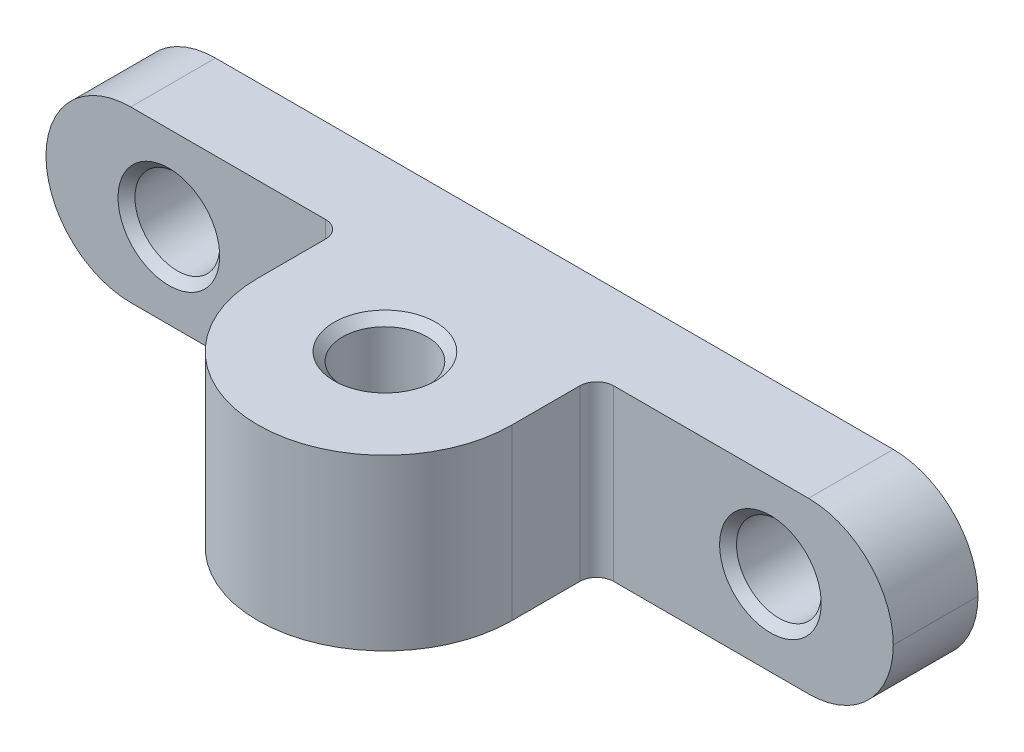
ISO-10303-21;
HEADER;
FILE_DESCRIPTION(('STEP AP214'),'2;1');
FILE_NAME('part.step','',(''),(''),'','','');
FILE_SCHEMA(('AUTOMOTIVE_DESIGN { 1 0 10303 214 1 1 1 1 }'));
ENDSEC;
DATA;
#1=APPLICATION_CONTEXT('core data for automotive mechanical design processes');
#2=APPLICATION_PROTOCOL_DEFINITION('international standard','automotive_design',2000,#1);
#3=PRODUCT_CONTEXT('',#1,'mechanical');
#4=PRODUCT('Part','Part','',(#3));
#5=PRODUCT_RELATED_PRODUCT_CATEGORY('part','',(#4));
#6=PRODUCT_DEFINITION_FORMATION('','',#4);
#7=PRODUCT_DEFINITION_CONTEXT('part definition',#1,'design');
#8=PRODUCT_DEFINITION('design','',#6,#7);
#9=PRODUCT_DEFINITION_SHAPE('','',#8);
#10=(LENGTH_UNIT() NAMED_UNIT(*) SI_UNIT(.MILLI.,.METRE.));
#11=(NAMED_UNIT(*) PLANE_ANGLE_UNIT() SI_UNIT($,.RADIAN.));
#12=(NAMED_UNIT(*) SI_UNIT($,.STERADIAN.) SOLID_ANGLE_UNIT());
#13=UNCERTAINTY_MEASURE_WITH_UNIT(LENGTH_MEASURE(1.E-05),#10,'distance_accuracy_value','');
#14=(GEOMETRIC_REPRESENTATION_CONTEXT(3) GLOBAL_UNCERTAINTY_ASSIGNED_CONTEXT((#13)) GLOBAL_UNIT_ASSIGNED_CONTEXT((#10,
#11,#12)) REPRESENTATION_CONTEXT('',''));
#15=CARTESIAN_POINT('',(0.,0.,0.));
#16=DIRECTION('',(0.,0.,1.));
#17=DIRECTION('',(1.,0.,0.));
#18=AXIS2_PLACEMENT_3D('',#15,#16,#17);
#19=CARTESIAN_POINT('',(0.,5.08,0.));
#20=DIRECTION('',(0.,1.,0.));
#21=DIRECTION('',(0.,0.,1.));
#22=AXIS2_PLACEMENT_3D('',#19,#20,#21);
#23=PLANE('',#22);
#24=CARTESIAN_POINT('',(0.,5.08,0.));
#25=DIRECTION('',(0.,1.,0.));
#26=DIRECTION('',(0.,0.,1.));
#27=AXIS2_PLACEMENT_3D('',#24,#25,#26);
#28=CIRCLE('',#27,1.52400000000001);
#29=CARTESIAN_POINT('',(0.,5.08,1.52400000000001));
#30=VERTEX_POINT('',#29);
#31=EDGE_CURVE('E220',#30,#30,#28,.F.);
#32=ORIENTED_EDGE('',*,*,#31,.T.);
#33=EDGE_LOOP('',(#32));
#34=FACE_BOUND('',#33,.T.);
#35=DIRECTION('',(-1.,0.,0.));
#36=VECTOR('',#35,1.);
#37=CARTESIAN_POINT('',(-12.7,5.08,-5.08));
#38=LINE('',#37,#36);
#39=CARTESIAN_POINT('',(10.16,5.08,-5.08));
#40=VERTEX_POINT('',#39);
#41=CARTESIAN_POINT('',(-10.16,5.08,-5.08));
#42=VERTEX_POINT('',#41);
#43=EDGE_CURVE('E155',#40,#42,#38,.T.);
#44=ORIENTED_EDGE('',*,*,#43,.T.);
#45=DIRECTION('',(0.,0.,1.));
#46=VECTOR('',#45,1.);
#47=CARTESIAN_POINT('',(-10.16,5.08,-2.54));
#48=LINE('',#47,#46);
#49=CARTESIAN_POINT('',(-10.16,5.08,-2.54));
#50=VERTEX_POINT('',#49);
#51=EDGE_CURVE('E174',#42,#50,#48,.T.);
#52=ORIENTED_EDGE('',*,*,#51,.T.);
#53=DIRECTION('',(1.,0.,0.));
#54=VECTOR('',#53,1.);
#55=CARTESIAN_POINT('',(-3.81,5.08,-2.54));
#56=LINE('',#55,#54);
#57=CARTESIAN_POINT('',(-4.318,5.08,-2.54));
#58=VERTEX_POINT('',#57);
#59=EDGE_CURVE('E134',#50,#58,#56,.T.);
#60=ORIENTED_EDGE('',*,*,#59,.T.);
#61=CARTESIAN_POINT('',(-4.318,5.08,-2.032));
#62=DIRECTION('',(0.,1.,0.));
#63=DIRECTION('',(0.,0.,1.));
#64=AXIS2_PLACEMENT_3D('',#61,#62,#63);
#65=CIRCLE('',#64,0.508);
#66=CARTESIAN_POINT('',(-3.81,5.08,-2.032));
#67=VERTEX_POINT('',#66);
#68=EDGE_CURVE('E11',#58,#67,#65,.F.);
#69=ORIENTED_EDGE('',*,*,#68,.T.);
#70=DIRECTION('',(0.,0.,1.));
#71=VECTOR('',#70,1.);
#72=CARTESIAN_POINT('',(-3.81,5.08,0.));
#73=LINE('',#72,#71);
#74=CARTESIAN_POINT('',(-3.81,5.08,0.));
#75=VERTEX_POINT('',#74);
#76=EDGE_CURVE('E123',#67,#75,#73,.T.);
#77=ORIENTED_EDGE('',*,*,#76,.T.);
#78=CARTESIAN_POINT('',(0.,5.08,0.));
#79=DIRECTION('',(0.,1.,0.));
#80=DIRECTION('',(0.,0.,1.));
#81=AXIS2_PLACEMENT_3D('',#78,#79,#80);
#82=CIRCLE('',#81,3.81);
#83=CARTESIAN_POINT('',(3.81,5.08,0.));
#84=VERTEX_POINT('',#83);
#85=EDGE_CURVE('E128',#75,#84,#82,.T.);
#86=ORIENTED_EDGE('',*,*,#85,.T.);
#87=DIRECTION('',(0.,0.,-1.));
#88=VECTOR('',#87,1.);
#89=CARTESIAN_POINT('',(3.81,5.08,0.));
#90=LINE('',#89,#88);
#91=CARTESIAN_POINT('',(3.81,5.08,-2.032));
#92=VERTEX_POINT('',#91);
#93=EDGE_CURVE('E148',#84,#92,#90,.T.);
#94=ORIENTED_EDGE('',*,*,#93,.T.);
#95=CARTESIAN_POINT('',(4.318,5.08,-2.032));
#96=DIRECTION('',(0.,1.,0.));
#97=DIRECTION('',(0.,0.,1.));
#98=AXIS2_PLACEMENT_3D('',#95,#96,#97);
#99=CIRCLE('',#98,0.508);
#100=CARTESIAN_POINT('',(4.318,5.08,-2.54));
#101=VERTEX_POINT('',#100);
#102=EDGE_CURVE('E239',#92,#101,#99,.F.);
#103=ORIENTED_EDGE('',*,*,#102,.T.);
#104=DIRECTION('',(1.,0.,0.));
#105=VECTOR('',#104,1.);
#106=CARTESIAN_POINT('',(12.7,5.08,-2.54));
#107=LINE('',#106,#105);
#108=CARTESIAN_POINT('',(10.16,5.08,-2.54));
#109=VERTEX_POINT('',#108);
#110=EDGE_CURVE('E150',#101,#109,#107,.T.);
#111=ORIENTED_EDGE('',*,*,#110,.T.);
#112=DIRECTION('',(0.,0.,-1.));
#113=VECTOR('',#112,1.);
#114=CARTESIAN_POINT('',(10.16,5.08,-5.08));
#115=LINE('',#114,#113);
#116=EDGE_CURVE('E142',#109,#40,#115,.T.);
#117=ORIENTED_EDGE('',*,*,#116,.T.);
#118=EDGE_LOOP('',(#44,#52,#60,#69,#77,#86,#94,#103,#111,#117));
#119=FACE_BOUND('',#118,.T.);
#120=ADVANCED_FACE('F35',(#34,#119),#23,.T.);
#121=CARTESIAN_POINT('',(0.,0.,0.));
#122=DIRECTION('',(0.,1.,0.));
#123=DIRECTION('',(0.,0.,1.));
#124=AXIS2_PLACEMENT_3D('',#121,#122,#123);
#125=PLANE('',#124);
#126=CARTESIAN_POINT('',(0.,0.,0.));
#127=DIRECTION('',(0.,1.,0.));
#128=DIRECTION('',(0.,0.,1.));
#129=AXIS2_PLACEMENT_3D('',#126,#127,#128);
#130=CIRCLE('',#129,1.524);
#131=CARTESIAN_POINT('',(0.,0.,1.524));
#132=VERTEX_POINT('',#131);
#133=EDGE_CURVE('E199',#132,#132,#130,.T.);
#134=ORIENTED_EDGE('',*,*,#133,.T.);
#135=EDGE_LOOP('',(#134));
#136=FACE_BOUND('',#135,.T.);
#137=DIRECTION('',(1.,0.,0.));
#138=VECTOR('',#137,1.);
#139=CARTESIAN_POINT('',(-3.81,0.,-2.54));
#140=LINE('',#139,#138);
#141=CARTESIAN_POINT('',(-10.16,0.,-2.54));
#142=VERTEX_POINT('',#141);
#143=CARTESIAN_POINT('',(-4.318,0.,-2.54));
#144=VERTEX_POINT('',#143);
#145=EDGE_CURVE('E157',#142,#144,#140,.T.);
#146=ORIENTED_EDGE('',*,*,#145,.F.);
#147=DIRECTION('',(0.,0.,1.));
#148=VECTOR('',#147,1.);
#149=CARTESIAN_POINT('',(-10.16,0.,0.));
#150=LINE('',#149,#148);
#151=CARTESIAN_POINT('',(-10.16,0.,-5.08));
#152=VERTEX_POINT('',#151);
#153=EDGE_CURVE('E192',#142,#152,#150,.F.);
#154=ORIENTED_EDGE('',*,*,#153,.T.);
#155=DIRECTION('',(-1.,0.,0.));
#156=VECTOR('',#155,1.);
#157=CARTESIAN_POINT('',(-12.7,0.,-5.08));
#158=LINE('',#157,#156);
#159=CARTESIAN_POINT('',(10.16,0.,-5.08));
#160=VERTEX_POINT('',#159);
#161=EDGE_CURVE('E168',#160,#152,#158,.T.);
#162=ORIENTED_EDGE('',*,*,#161,.F.);
#163=DIRECTION('',(0.,0.,-1.));
#164=VECTOR('',#163,1.);
#165=CARTESIAN_POINT('',(10.16,0.,0.));
#166=LINE('',#165,#164);
#167=CARTESIAN_POINT('',(10.16,0.,-2.54));
#168=VERTEX_POINT('',#167);
#169=EDGE_CURVE('E189',#160,#168,#166,.F.);
#170=ORIENTED_EDGE('',*,*,#169,.T.);
#171=DIRECTION('',(1.,0.,0.));
#172=VECTOR('',#171,1.);
#173=CARTESIAN_POINT('',(12.7,0.,-2.54));
#174=LINE('',#173,#172);
#175=CARTESIAN_POINT('',(4.318,0.,-2.54));
#176=VERTEX_POINT('',#175);
#177=EDGE_CURVE('E166',#176,#168,#174,.T.);
#178=ORIENTED_EDGE('',*,*,#177,.F.);
#179=CARTESIAN_POINT('',(4.318,0.,-2.032));
#180=DIRECTION('',(0.,1.,0.));
#181=DIRECTION('',(0.,0.,1.));
#182=AXIS2_PLACEMENT_3D('',#179,#180,#181);
#183=CIRCLE('',#182,0.508);
#184=CARTESIAN_POINT('',(3.81,0.,-2.032));
#185=VERTEX_POINT('',#184);
#186=EDGE_CURVE('E237',#176,#185,#183,.T.);
#187=ORIENTED_EDGE('',*,*,#186,.T.);
#188=DIRECTION('',(0.,0.,-1.));
#189=VECTOR('',#188,1.);
#190=CARTESIAN_POINT('',(3.81,0.,0.));
#191=LINE('',#190,#189);
#192=CARTESIAN_POINT('',(3.81,0.,0.));
#193=VERTEX_POINT('',#192);
#194=EDGE_CURVE('E163',#193,#185,#191,.T.);
#195=ORIENTED_EDGE('',*,*,#194,.F.);
#196=CARTESIAN_POINT('',(0.,0.,0.));
#197=DIRECTION('',(0.,1.,0.));
#198=DIRECTION('',(0.,0.,1.));
#199=AXIS2_PLACEMENT_3D('',#196,#197,#198);
#200=CIRCLE('',#199,3.81);
#201=CARTESIAN_POINT('',(-3.81,0.,0.));
#202=VERTEX_POINT('',#201);
#203=EDGE_CURVE('E161',#202,#193,#200,.T.);
#204=ORIENTED_EDGE('',*,*,#203,.F.);
#205=DIRECTION('',(0.,0.,1.));
#206=VECTOR('',#205,1.);
#207=CARTESIAN_POINT('',(-3.81,0.,0.));
#208=LINE('',#207,#206);
#209=CARTESIAN_POINT('',(-3.81,0.,-2.032));
#210=VERTEX_POINT('',#209);
#211=EDGE_CURVE('E139',#210,#202,#208,.T.);
#212=ORIENTED_EDGE('',*,*,#211,.F.);
#213=CARTESIAN_POINT('',(-4.318,0.,-2.032));
#214=DIRECTION('',(0.,1.,0.));
#215=DIRECTION('',(0.,0.,1.));
#216=AXIS2_PLACEMENT_3D('',#213,#214,#215);
#217=CIRCLE('',#216,0.508);
#218=EDGE_CURVE('E43',#210,#144,#217,.T.);
#219=ORIENTED_EDGE('',*,*,#218,.T.);
#220=EDGE_LOOP('',(#146,#154,#162,#170,#178,#187,#195,#204,#212,#219));
#221=FACE_BOUND('',#220,.T.);
#222=ADVANCED_FACE('F252',(#136,#221),#125,.F.);
#223=CARTESIAN_POINT('',(-3.81,5.08,-2.54));
#224=DIRECTION('',(0.,0.,-1.));
#225=DIRECTION('',(-1.,0.,0.));
#226=AXIS2_PLACEMENT_3D('',#223,#224,#225);
#227=PLANE('',#226);
#228=CARTESIAN_POINT('',(-9.017,2.54,-2.54));
#229=DIRECTION('',(0.,0.,-1.));
#230=DIRECTION('',(-1.,0.,0.));
#231=AXIS2_PLACEMENT_3D('',#228,#229,#230);
#232=CIRCLE('',#231,1.524);
#233=CARTESIAN_POINT('',(-10.541,2.54,-2.54));
#234=VERTEX_POINT('',#233);
#235=EDGE_CURVE('E223',#234,#234,#232,.T.);
#236=ORIENTED_EDGE('',*,*,#235,.T.);
#237=EDGE_LOOP('',(#236));
#238=FACE_BOUND('',#237,.T.);
#239=ORIENTED_EDGE('',*,*,#145,.T.);
#240=DIRECTION('',(0.,-1.,0.));
#241=VECTOR('',#240,1.);
#242=CARTESIAN_POINT('',(-4.318,5.08,-2.54));
#243=LINE('',#242,#241);
#244=EDGE_CURVE('E56',#144,#58,#243,.F.);
#245=ORIENTED_EDGE('',*,*,#244,.T.);
#246=ORIENTED_EDGE('',*,*,#59,.F.);
#247=CARTESIAN_POINT('',(-10.16,2.54,-2.54));
#248=DIRECTION('',(0.,0.,-1.));
#249=DIRECTION('',(-1.,0.,0.));
#250=AXIS2_PLACEMENT_3D('',#247,#248,#249);
#251=CIRCLE('',#250,2.54);
#252=CARTESIAN_POINT('',(-12.7,2.54,-2.54));
#253=VERTEX_POINT('',#252);
#254=EDGE_CURVE('E179',#50,#253,#251,.F.);
#255=ORIENTED_EDGE('',*,*,#254,.T.);
#256=CARTESIAN_POINT('',(-10.16,2.54,-2.54));
#257=DIRECTION('',(0.,0.,-1.));
#258=DIRECTION('',(-1.,0.,0.));
#259=AXIS2_PLACEMENT_3D('',#256,#257,#258);
#260=CIRCLE('',#259,2.54);
#261=EDGE_CURVE('E177',#253,#142,#260,.F.);
#262=ORIENTED_EDGE('',*,*,#261,.T.);
#263=EDGE_LOOP('',(#239,#245,#246,#255,#262));
#264=FACE_BOUND('',#263,.T.);
#265=ADVANCED_FACE('F271',(#238,#264),#227,.F.);
#266=CARTESIAN_POINT('',(-3.81,5.08,0.));
#267=DIRECTION('',(1.,0.,0.));
#268=DIRECTION('',(0.,0.,-1.));
#269=AXIS2_PLACEMENT_3D('',#266,#267,#268);
#270=PLANE('',#269);
#271=ORIENTED_EDGE('',*,*,#76,.F.);
#272=DIRECTION('',(0.,-1.,0.));
#273=VECTOR('',#272,1.);
#274=CARTESIAN_POINT('',(-3.81,0.,-2.032));
#275=LINE('',#274,#273);
#276=EDGE_CURVE('E234',#67,#210,#275,.T.);
#277=ORIENTED_EDGE('',*,*,#276,.T.);
#278=ORIENTED_EDGE('',*,*,#211,.T.);
#279=DIRECTION('',(0.,-1.,0.));
#280=VECTOR('',#279,1.);
#281=CARTESIAN_POINT('',(-3.81,5.08,0.));
#282=LINE('',#281,#280);
#283=EDGE_CURVE('E137',#75,#202,#282,.T.);
#284=ORIENTED_EDGE('',*,*,#283,.F.);
#285=EDGE_LOOP('',(#271,#277,#278,#284));
#286=FACE_BOUND('',#285,.T.);
#287=ADVANCED_FACE('F138',(#286),#270,.F.);
#288=CARTESIAN_POINT('',(0.,5.08,0.));
#289=DIRECTION('',(0.,-1.,0.));
#290=DIRECTION('',(0.,0.,-1.));
#291=AXIS2_PLACEMENT_3D('',#288,#289,#290);
#292=CYLINDRICAL_SURFACE('',#291,3.81);
#293=ORIENTED_EDGE('',*,*,#203,.T.);
#294=DIRECTION('',(0.,-1.,0.));
#295=VECTOR('',#294,1.);
#296=CARTESIAN_POINT('',(3.81,5.08,0.));
#297=LINE('',#296,#295);
#298=EDGE_CURVE('E143',#84,#193,#297,.T.);
#299=ORIENTED_EDGE('',*,*,#298,.F.);
#300=ORIENTED_EDGE('',*,*,#85,.F.);
#301=ORIENTED_EDGE('',*,*,#283,.T.);
#302=EDGE_LOOP('',(#293,#299,#300,#301));
#303=FACE_BOUND('',#302,.T.);
#304=ADVANCED_FACE('F145',(#303),#292,.T.);
#305=CARTESIAN_POINT('',(3.81,5.08,0.));
#306=DIRECTION('',(-1.,0.,0.));
#307=DIRECTION('',(0.,0.,1.));
#308=AXIS2_PLACEMENT_3D('',#305,#306,#307);
#309=PLANE('',#308);
#310=ORIENTED_EDGE('',*,*,#194,.T.);
#311=DIRECTION('',(0.,-1.,0.));
#312=VECTOR('',#311,1.);
#313=CARTESIAN_POINT('',(3.81,5.08,-2.032));
#314=LINE('',#313,#312);
#315=EDGE_CURVE('E232',#185,#92,#314,.F.);
#316=ORIENTED_EDGE('',*,*,#315,.T.);
#317=ORIENTED_EDGE('',*,*,#93,.F.);
#318=ORIENTED_EDGE('',*,*,#298,.T.);
#319=EDGE_LOOP('',(#310,#316,#317,#318));
#320=FACE_BOUND('',#319,.T.);
#321=ADVANCED_FACE('F254',(#320),#309,.F.);
#322=CARTESIAN_POINT('',(12.7,5.08,-2.54));
#323=DIRECTION('',(0.,0.,-1.));
#324=DIRECTION('',(-1.,0.,0.));
#325=AXIS2_PLACEMENT_3D('',#322,#323,#324);
#326=PLANE('',#325);
#327=CARTESIAN_POINT('',(9.017,2.54,-2.54));
#328=DIRECTION('',(0.,0.,-1.));
#329=DIRECTION('',(-1.,0.,0.));
#330=AXIS2_PLACEMENT_3D('',#327,#328,#329);
#331=CIRCLE('',#330,1.524);
#332=CARTESIAN_POINT('',(7.49299999999999,2.54,-2.54));
#333=VERTEX_POINT('',#332);
#334=EDGE_CURVE('E214',#333,#333,#331,.T.);
#335=ORIENTED_EDGE('',*,*,#334,.T.);
#336=EDGE_LOOP('',(#335));
#337=FACE_BOUND('',#336,.T.);
#338=ORIENTED_EDGE('',*,*,#110,.F.);
#339=DIRECTION('',(0.,-1.,0.));
#340=VECTOR('',#339,1.);
#341=CARTESIAN_POINT('',(4.318,0.,-2.54));
#342=LINE('',#341,#340);
#343=EDGE_CURVE('E229',#101,#176,#342,.T.);
#344=ORIENTED_EDGE('',*,*,#343,.T.);
#345=ORIENTED_EDGE('',*,*,#177,.T.);
#346=CARTESIAN_POINT('',(10.16,2.54,-2.54));
#347=DIRECTION('',(0.,0.,-1.));
#348=DIRECTION('',(-1.,0.,0.));
#349=AXIS2_PLACEMENT_3D('',#346,#347,#348);
#350=CIRCLE('',#349,2.54);
#351=CARTESIAN_POINT('',(12.7,2.54,-2.54));
#352=VERTEX_POINT('',#351);
#353=EDGE_CURVE('E194',#168,#352,#350,.F.);
#354=ORIENTED_EDGE('',*,*,#353,.T.);
#355=CARTESIAN_POINT('',(10.16,2.54,-2.54));
#356=DIRECTION('',(0.,0.,-1.));
#357=DIRECTION('',(-1.,0.,0.));
#358=AXIS2_PLACEMENT_3D('',#355,#356,#357);
#359=CIRCLE('',#358,2.54);
#360=EDGE_CURVE('E196',#352,#109,#359,.F.);
#361=ORIENTED_EDGE('',*,*,#360,.T.);
#362=EDGE_LOOP('',(#338,#344,#345,#354,#361));
#363=FACE_BOUND('',#362,.T.);
#364=ADVANCED_FACE('F246',(#337,#363),#326,.F.);
#365=CARTESIAN_POINT('',(-12.7,5.08,-5.08));
#366=DIRECTION('',(0.,0.,1.));
#367=DIRECTION('',(1.,0.,0.));
#368=AXIS2_PLACEMENT_3D('',#365,#366,#367);
#369=PLANE('',#368);
#370=CARTESIAN_POINT('',(-9.017,2.54,-5.08));
#371=DIRECTION('',(0.,0.,1.));
#372=DIRECTION('',(1.,0.,0.));
#373=AXIS2_PLACEMENT_3D('',#370,#371,#372);
#374=CIRCLE('',#373,1.27);
#375=CARTESIAN_POINT('',(-7.747,2.54,-5.08));
#376=VERTEX_POINT('',#375);
#377=EDGE_CURVE('E205',#376,#376,#374,.T.);
#378=ORIENTED_EDGE('',*,*,#377,.T.);
#379=EDGE_LOOP('',(#378));
#380=FACE_BOUND('',#379,.T.);
#381=CARTESIAN_POINT('',(9.017,2.54,-5.08));
#382=DIRECTION('',(0.,0.,1.));
#383=DIRECTION('',(1.,0.,0.));
#384=AXIS2_PLACEMENT_3D('',#381,#382,#383);
#385=CIRCLE('',#384,1.27);
#386=CARTESIAN_POINT('',(10.287,2.54,-5.08));
#387=VERTEX_POINT('',#386);
#388=EDGE_CURVE('E291',#387,#387,#385,.T.);
#389=ORIENTED_EDGE('',*,*,#388,.T.);
#390=EDGE_LOOP('',(#389));
#391=FACE_BOUND('',#390,.T.);
#392=CARTESIAN_POINT('',(-10.16,2.54,-5.08));
#393=DIRECTION('',(0.,0.,1.));
#394=DIRECTION('',(1.,0.,0.));
#395=AXIS2_PLACEMENT_3D('',#392,#393,#394);
#396=CIRCLE('',#395,2.54);
#397=CARTESIAN_POINT('',(-12.7,2.54,-5.08));
#398=VERTEX_POINT('',#397);
#399=EDGE_CURVE('E185',#152,#398,#396,.F.);
#400=ORIENTED_EDGE('',*,*,#399,.T.);
#401=CARTESIAN_POINT('',(-10.16,2.54,-5.08));
#402=DIRECTION('',(0.,0.,1.));
#403=DIRECTION('',(1.,0.,0.));
#404=AXIS2_PLACEMENT_3D('',#401,#402,#403);
#405=CIRCLE('',#404,2.54);
#406=EDGE_CURVE('E187',#398,#42,#405,.F.);
#407=ORIENTED_EDGE('',*,*,#406,.T.);
#408=ORIENTED_EDGE('',*,*,#43,.F.);
#409=CARTESIAN_POINT('',(10.16,2.54,-5.08));
#410=DIRECTION('',(0.,0.,1.));
#411=DIRECTION('',(1.,0.,0.));
#412=AXIS2_PLACEMENT_3D('',#409,#410,#411);
#413=CIRCLE('',#412,2.54);
#414=CARTESIAN_POINT('',(12.7,2.54,-5.08));
#415=VERTEX_POINT('',#414);
#416=EDGE_CURVE('E183',#40,#415,#413,.F.);
#417=ORIENTED_EDGE('',*,*,#416,.T.);
#418=CARTESIAN_POINT('',(10.16,2.54,-5.08));
#419=DIRECTION('',(0.,0.,1.));
#420=DIRECTION('',(1.,0.,0.));
#421=AXIS2_PLACEMENT_3D('',#418,#419,#420);
#422=CIRCLE('',#421,2.54);
#423=EDGE_CURVE('E181',#415,#160,#422,.F.);
#424=ORIENTED_EDGE('',*,*,#423,.T.);
#425=ORIENTED_EDGE('',*,*,#161,.T.);
#426=EDGE_LOOP('',(#400,#407,#408,#417,#424,#425));
#427=FACE_BOUND('',#426,.T.);
#428=ADVANCED_FACE('F261',(#380,#391,#427),#369,.F.);
#429=CARTESIAN_POINT('',(0.,5.08,0.));
#430=DIRECTION('',(0.,-1.,0.));
#431=DIRECTION('',(0.,0.,-1.));
#432=AXIS2_PLACEMENT_3D('',#429,#430,#431);
#433=CYLINDRICAL_SURFACE('',#432,1.27);
#434=CARTESIAN_POINT('',(0.,0.254000000000003,0.));
#435=DIRECTION('',(0.,1.,0.));
#436=DIRECTION('',(0.,0.,1.));
#437=AXIS2_PLACEMENT_3D('',#434,#435,#436);
#438=CIRCLE('',#437,1.27);
#439=CARTESIAN_POINT('',(0.,0.254000000000003,1.27));
#440=VERTEX_POINT('',#439);
#441=EDGE_CURVE('E211',#440,#440,#438,.F.);
#442=ORIENTED_EDGE('',*,*,#441,.T.);
#443=EDGE_LOOP('',(#442));
#444=FACE_BOUND('',#443,.T.);
#445=CARTESIAN_POINT('',(0.,4.82599999999999,0.));
#446=DIRECTION('',(0.,1.,0.));
#447=DIRECTION('',(0.,0.,1.));
#448=AXIS2_PLACEMENT_3D('',#445,#446,#447);
#449=CIRCLE('',#448,1.27);
#450=CARTESIAN_POINT('',(0.,4.82599999999999,1.27));
#451=VERTEX_POINT('',#450);
#452=EDGE_CURVE('E208',#451,#451,#449,.T.);
#453=ORIENTED_EDGE('',*,*,#452,.T.);
#454=EDGE_LOOP('',(#453));
#455=FACE_BOUND('',#454,.T.);
#456=ADVANCED_FACE('F275',(#444,#455),#433,.F.);
#457=CARTESIAN_POINT('',(-10.16,2.54,-2.54));
#458=DIRECTION('',(0.,0.,1.));
#459=DIRECTION('',(1.,0.,0.));
#460=AXIS2_PLACEMENT_3D('',#457,#458,#459);
#461=CYLINDRICAL_SURFACE('',#460,2.54);
#462=DIRECTION('',(0.,0.,1.));
#463=VECTOR('',#462,1.);
#464=CARTESIAN_POINT('',(-12.7,2.54,-2.54));
#465=LINE('',#464,#463);
#466=EDGE_CURVE('E159',#398,#253,#465,.T.);
#467=ORIENTED_EDGE('',*,*,#466,.F.);
#468=ORIENTED_EDGE('',*,*,#399,.F.);
#469=ORIENTED_EDGE('',*,*,#153,.F.);
#470=ORIENTED_EDGE('',*,*,#261,.F.);
#471=EDGE_LOOP('',(#467,#468,#469,#470));
#472=FACE_BOUND('',#471,.T.);
#473=ADVANCED_FACE('F283',(#472),#461,.T.);
#474=CARTESIAN_POINT('',(-10.16,2.54,0.));
#475=DIRECTION('',(0.,0.,-1.));
#476=DIRECTION('',(-1.,0.,0.));
#477=AXIS2_PLACEMENT_3D('',#474,#475,#476);
#478=CYLINDRICAL_SURFACE('',#477,2.54);
#479=ORIENTED_EDGE('',*,*,#406,.F.);
#480=ORIENTED_EDGE('',*,*,#466,.T.);
#481=ORIENTED_EDGE('',*,*,#254,.F.);
#482=ORIENTED_EDGE('',*,*,#51,.F.);
#483=EDGE_LOOP('',(#479,#480,#481,#482));
#484=FACE_BOUND('',#483,.T.);
#485=ADVANCED_FACE('F302',(#484),#478,.T.);
#486=CARTESIAN_POINT('',(10.16,2.54,-5.08));
#487=DIRECTION('',(0.,0.,-1.));
#488=DIRECTION('',(-1.,0.,0.));
#489=AXIS2_PLACEMENT_3D('',#486,#487,#488);
#490=CYLINDRICAL_SURFACE('',#489,2.54);
#491=DIRECTION('',(0.,0.,-1.));
#492=VECTOR('',#491,1.);
#493=CARTESIAN_POINT('',(12.7,2.54,-5.08));
#494=LINE('',#493,#492);
#495=EDGE_CURVE('E202',#352,#415,#494,.T.);
#496=ORIENTED_EDGE('',*,*,#495,.F.);
#497=ORIENTED_EDGE('',*,*,#353,.F.);
#498=ORIENTED_EDGE('',*,*,#169,.F.);
#499=ORIENTED_EDGE('',*,*,#423,.F.);
#500=EDGE_LOOP('',(#496,#497,#498,#499));
#501=FACE_BOUND('',#500,.T.);
#502=ADVANCED_FACE('F310',(#501),#490,.T.);
#503=CARTESIAN_POINT('',(10.16,2.54,0.));
#504=DIRECTION('',(0.,0.,1.));
#505=DIRECTION('',(1.,0.,0.));
#506=AXIS2_PLACEMENT_3D('',#503,#504,#505);
#507=CYLINDRICAL_SURFACE('',#506,2.54);
#508=ORIENTED_EDGE('',*,*,#360,.F.);
#509=ORIENTED_EDGE('',*,*,#495,.T.);
#510=ORIENTED_EDGE('',*,*,#416,.F.);
#511=ORIENTED_EDGE('',*,*,#116,.F.);
#512=EDGE_LOOP('',(#508,#509,#510,#511));
#513=FACE_BOUND('',#512,.T.);
#514=ADVANCED_FACE('F312',(#513),#507,.T.);
#515=CARTESIAN_POINT('',(9.017,2.54,-5.08));
#516=DIRECTION('',(0.,0.,1.));
#517=DIRECTION('',(1.,0.,0.));
#518=AXIS2_PLACEMENT_3D('',#515,#516,#517);
#519=CYLINDRICAL_SURFACE('',#518,1.27);
#520=CARTESIAN_POINT('',(9.017,2.54,-2.794));
#521=DIRECTION('',(0.,0.,-1.));
#522=DIRECTION('',(-1.,0.,0.));
#523=AXIS2_PLACEMENT_3D('',#520,#521,#522);
#524=CIRCLE('',#523,1.27);
#525=CARTESIAN_POINT('',(7.747,2.54,-2.794));
#526=VERTEX_POINT('',#525);
#527=EDGE_CURVE('E217',#526,#526,#524,.F.);
#528=ORIENTED_EDGE('',*,*,#527,.T.);
#529=EDGE_LOOP('',(#528));
#530=FACE_BOUND('',#529,.T.);
#531=ORIENTED_EDGE('',*,*,#388,.F.);
#532=EDGE_LOOP('',(#531));
#533=FACE_BOUND('',#532,.T.);
#534=ADVANCED_FACE('F314',(#530,#533),#519,.F.);
#535=CARTESIAN_POINT('',(-9.017,2.54,-5.08));
#536=DIRECTION('',(0.,0.,1.));
#537=DIRECTION('',(1.,0.,0.));
#538=AXIS2_PLACEMENT_3D('',#535,#536,#537);
#539=CYLINDRICAL_SURFACE('',#538,1.27);
#540=CARTESIAN_POINT('',(-9.017,2.54,-2.794));
#541=DIRECTION('',(0.,0.,-1.));
#542=DIRECTION('',(-1.,0.,0.));
#543=AXIS2_PLACEMENT_3D('',#540,#541,#542);
#544=CIRCLE('',#543,1.27);
#545=CARTESIAN_POINT('',(-10.287,2.54,-2.794));
#546=VERTEX_POINT('',#545);
#547=EDGE_CURVE('E226',#546,#546,#544,.F.);
#548=ORIENTED_EDGE('',*,*,#547,.T.);
#549=EDGE_LOOP('',(#548));
#550=FACE_BOUND('',#549,.T.);
#551=ORIENTED_EDGE('',*,*,#377,.F.);
#552=EDGE_LOOP('',(#551));
#553=FACE_BOUND('',#552,.T.);
#554=ADVANCED_FACE('F320',(#550,#553),#539,.F.);
#555=CARTESIAN_POINT('',(0.,0.,0.));
#556=DIRECTION('',(0.,-1.,0.));
#557=DIRECTION('',(0.,0.,-1.));
#558=AXIS2_PLACEMENT_3D('',#555,#556,#557);
#559=CONICAL_SURFACE('',#558,1.524,0.785398163397451);
#560=ORIENTED_EDGE('',*,*,#441,.F.);
#561=EDGE_LOOP('',(#560));
#562=FACE_BOUND('',#561,.T.);
#563=ORIENTED_EDGE('',*,*,#133,.F.);
#564=EDGE_LOOP('',(#563));
#565=FACE_BOUND('',#564,.T.);
#566=ADVANCED_FACE('F327',(#562,#565),#559,.F.);
#567=CARTESIAN_POINT('',(9.017,2.54,-2.54));
#568=DIRECTION('',(0.,0.,1.));
#569=DIRECTION('',(1.,0.,0.));
#570=AXIS2_PLACEMENT_3D('',#567,#568,#569);
#571=CONICAL_SURFACE('',#570,1.524,0.785398163397446);
#572=ORIENTED_EDGE('',*,*,#527,.F.);
#573=EDGE_LOOP('',(#572));
#574=FACE_BOUND('',#573,.T.);
#575=ORIENTED_EDGE('',*,*,#334,.F.);
#576=EDGE_LOOP('',(#575));
#577=FACE_BOUND('',#576,.T.);
#578=ADVANCED_FACE('F333',(#574,#577),#571,.F.);
#579=CARTESIAN_POINT('',(0.,4.82599999999999,0.));
#580=DIRECTION('',(0.,1.,0.));
#581=DIRECTION('',(0.,0.,1.));
#582=AXIS2_PLACEMENT_3D('',#579,#580,#581);
#583=CONICAL_SURFACE('',#582,1.27,0.785398163397453);
#584=ORIENTED_EDGE('',*,*,#31,.F.);
#585=EDGE_LOOP('',(#584));
#586=FACE_BOUND('',#585,.T.);
#587=ORIENTED_EDGE('',*,*,#452,.F.);
#588=EDGE_LOOP('',(#587));
#589=FACE_BOUND('',#588,.T.);
#590=ADVANCED_FACE('F340',(#586,#589),#583,.F.);
#591=CARTESIAN_POINT('',(-9.017,2.54,-2.54));
#592=DIRECTION('',(0.,0.,1.));
#593=DIRECTION('',(1.,0.,0.));
#594=AXIS2_PLACEMENT_3D('',#591,#592,#593);
#595=CONICAL_SURFACE('',#594,1.524,0.78539816339745);
#596=ORIENTED_EDGE('',*,*,#547,.F.);
#597=EDGE_LOOP('',(#596));
#598=FACE_BOUND('',#597,.T.);
#599=ORIENTED_EDGE('',*,*,#235,.F.);
#600=EDGE_LOOP('',(#599));
#601=FACE_BOUND('',#600,.T.);
#602=ADVANCED_FACE('F347',(#598,#601),#595,.F.);
#603=CARTESIAN_POINT('',(4.318,5.08,-2.032));
#604=DIRECTION('',(0.,1.,0.));
#605=DIRECTION('',(0.,0.,1.));
#606=AXIS2_PLACEMENT_3D('',#603,#604,#605);
#607=CYLINDRICAL_SURFACE('',#606,0.508);
#608=ORIENTED_EDGE('',*,*,#102,.F.);
#609=ORIENTED_EDGE('',*,*,#315,.F.);
#610=ORIENTED_EDGE('',*,*,#186,.F.);
#611=ORIENTED_EDGE('',*,*,#343,.F.);
#612=EDGE_LOOP('',(#608,#609,#610,#611));
#613=FACE_BOUND('',#612,.T.);
#614=ADVANCED_FACE('F250',(#613),#607,.F.);
#615=CARTESIAN_POINT('',(-4.318,5.08,-2.032));
#616=DIRECTION('',(0.,1.,0.));
#617=DIRECTION('',(0.,0.,1.));
#618=AXIS2_PLACEMENT_3D('',#615,#616,#617);
#619=CYLINDRICAL_SURFACE('',#618,0.508);
#620=ORIENTED_EDGE('',*,*,#68,.F.);
#621=ORIENTED_EDGE('',*,*,#244,.F.);
#622=ORIENTED_EDGE('',*,*,#218,.F.);
#623=ORIENTED_EDGE('',*,*,#276,.F.);
#624=EDGE_LOOP('',(#620,#621,#622,#623));
#625=FACE_BOUND('',#624,.T.);
#626=ADVANCED_FACE('F37',(#625),#619,.F.);
#627=CLOSED_SHELL('',(#120,#222,#265,#287,#304,#321,#364,#428,#456,#473,#485,#502,#514,#534,
#554,#566,#578,#590,#602,#614,#626));
#628=MANIFOLD_SOLID_BREP('B2',#627);
#629=ADVANCED_BREP_SHAPE_REPRESENTATION('',(#18,#628),#14);
#630=SHAPE_DEFINITION_REPRESENTATION(#9,#629);
ENDSEC;
END-ISO-10303-21;
